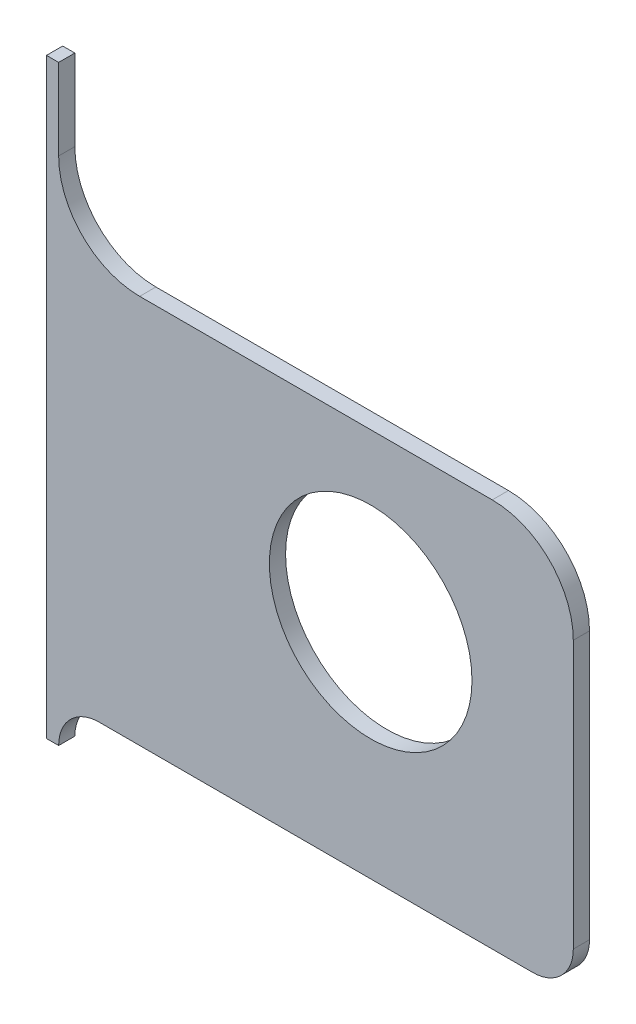
ISO-10303-21;
HEADER;
FILE_DESCRIPTION(('STEP AP214'),'2;1');
FILE_NAME('part.step','',(''),(''),'','','');
FILE_SCHEMA(('AUTOMOTIVE_DESIGN { 1 0 10303 214 1 1 1 1 }'));
ENDSEC;
DATA;
#1=APPLICATION_CONTEXT('core data for automotive mechanical design processes');
#2=APPLICATION_PROTOCOL_DEFINITION('international standard','automotive_design',2000,#1);
#3=PRODUCT_CONTEXT('',#1,'mechanical');
#4=PRODUCT('Part','Part','',(#3));
#5=PRODUCT_RELATED_PRODUCT_CATEGORY('part','',(#4));
#6=PRODUCT_DEFINITION_FORMATION('','',#4);
#7=PRODUCT_DEFINITION_CONTEXT('part definition',#1,'design');
#8=PRODUCT_DEFINITION('design','',#6,#7);
#9=PRODUCT_DEFINITION_SHAPE('','',#8);
#10=(LENGTH_UNIT() NAMED_UNIT(*) SI_UNIT(.MILLI.,.METRE.));
#11=(NAMED_UNIT(*) PLANE_ANGLE_UNIT() SI_UNIT($,.RADIAN.));
#12=(NAMED_UNIT(*) SI_UNIT($,.STERADIAN.) SOLID_ANGLE_UNIT());
#13=UNCERTAINTY_MEASURE_WITH_UNIT(LENGTH_MEASURE(1.E-05),#10,'distance_accuracy_value','');
#14=(GEOMETRIC_REPRESENTATION_CONTEXT(3) GLOBAL_UNCERTAINTY_ASSIGNED_CONTEXT((#13)) GLOBAL_UNIT_ASSIGNED_CONTEXT((#10,
#11,#12)) REPRESENTATION_CONTEXT('',''));
#15=CARTESIAN_POINT('',(0.,0.,0.));
#16=DIRECTION('',(0.,0.,1.));
#17=DIRECTION('',(1.,0.,0.));
#18=AXIS2_PLACEMENT_3D('',#15,#16,#17);
#19=CARTESIAN_POINT('',(0.,0.,42.));
#20=DIRECTION('',(0.,0.,-1.));
#21=DIRECTION('',(-1.,0.,0.));
#22=AXIS2_PLACEMENT_3D('',#19,#20,#21);
#23=PLANE('',#22);
#24=CARTESIAN_POINT('',(0.,19.46,42.));
#25=DIRECTION('',(0.,0.,1.));
#26=DIRECTION('',(1.,0.,0.));
#27=AXIS2_PLACEMENT_3D('',#24,#25,#26);
#28=CIRCLE('',#27,12.5);
#29=CARTESIAN_POINT('',(12.5,19.46,42.));
#30=VERTEX_POINT('',#29);
#31=EDGE_CURVE('E146',#30,#30,#28,.T.);
#32=ORIENTED_EDGE('',*,*,#31,.F.);
#33=EDGE_LOOP('',(#32));
#34=FACE_BOUND('',#33,.T.);
#35=DIRECTION('',(-1.,0.,0.));
#36=VECTOR('',#35,1.);
#37=CARTESIAN_POINT('',(-38.5,-8.00000000000001,42.));
#38=LINE('',#37,#36);
#39=CARTESIAN_POINT('',(20.,-8.,42.));
#40=VERTEX_POINT('',#39);
#41=CARTESIAN_POINT('',(-33.5,-8.00000000000001,42.));
#42=VERTEX_POINT('',#41);
#43=EDGE_CURVE('E141',#40,#42,#38,.T.);
#44=ORIENTED_EDGE('',*,*,#43,.F.);
#45=CARTESIAN_POINT('',(20.,-3.,42.));
#46=DIRECTION('',(0.,0.,-1.));
#47=DIRECTION('',(-1.,0.,0.));
#48=AXIS2_PLACEMENT_3D('',#45,#46,#47);
#49=CIRCLE('',#48,5.);
#50=CARTESIAN_POINT('',(25.,-3.,42.));
#51=VERTEX_POINT('',#50);
#52=EDGE_CURVE('E58',#40,#51,#49,.F.);
#53=ORIENTED_EDGE('',*,*,#52,.T.);
#54=DIRECTION('',(0.,-1.,0.));
#55=VECTOR('',#54,1.);
#56=CARTESIAN_POINT('',(25.,40.,42.));
#57=LINE('',#56,#55);
#58=CARTESIAN_POINT('',(25.,30.,42.));
#59=VERTEX_POINT('',#58);
#60=EDGE_CURVE('E197',#59,#51,#57,.T.);
#61=ORIENTED_EDGE('',*,*,#60,.F.);
#62=CARTESIAN_POINT('',(15.,30.,42.));
#63=DIRECTION('',(0.,0.,-1.));
#64=DIRECTION('',(-1.,0.,0.));
#65=AXIS2_PLACEMENT_3D('',#62,#63,#64);
#66=CIRCLE('',#65,10.);
#67=CARTESIAN_POINT('',(15.,40.,42.));
#68=VERTEX_POINT('',#67);
#69=EDGE_CURVE('E201',#59,#68,#66,.F.);
#70=ORIENTED_EDGE('',*,*,#69,.T.);
#71=DIRECTION('',(1.,0.,0.));
#72=VECTOR('',#71,1.);
#73=CARTESIAN_POINT('',(-28.4999999999999,40.,42.));
#74=LINE('',#73,#72);
#75=CARTESIAN_POINT('',(-28.4999999999999,40.,42.));
#76=VERTEX_POINT('',#75);
#77=EDGE_CURVE('E200',#76,#68,#74,.T.);
#78=ORIENTED_EDGE('',*,*,#77,.F.);
#79=CARTESIAN_POINT('',(-28.5,50.,42.));
#80=DIRECTION('',(0.,0.,-1.));
#81=DIRECTION('',(-1.,0.,0.));
#82=AXIS2_PLACEMENT_3D('',#79,#80,#81);
#83=CIRCLE('',#82,10.);
#84=CARTESIAN_POINT('',(-38.5,50.0000000000001,42.));
#85=VERTEX_POINT('',#84);
#86=EDGE_CURVE('E206',#85,#76,#83,.F.);
#87=ORIENTED_EDGE('',*,*,#86,.F.);
#88=DIRECTION('',(0.,-1.,0.));
#89=VECTOR('',#88,1.);
#90=CARTESIAN_POINT('',(-38.5,60.,42.));
#91=LINE('',#90,#89);
#92=CARTESIAN_POINT('',(-38.5,60.,42.));
#93=VERTEX_POINT('',#92);
#94=EDGE_CURVE('E208',#93,#85,#91,.T.);
#95=ORIENTED_EDGE('',*,*,#94,.F.);
#96=DIRECTION('',(1.,0.,0.));
#97=VECTOR('',#96,1.);
#98=CARTESIAN_POINT('',(-40.,60.,42.));
#99=LINE('',#98,#97);
#100=CARTESIAN_POINT('',(-40.,60.,42.));
#101=VERTEX_POINT('',#100);
#102=EDGE_CURVE('E204',#101,#93,#99,.T.);
#103=ORIENTED_EDGE('',*,*,#102,.F.);
#104=DIRECTION('',(0.,1.,0.));
#105=VECTOR('',#104,1.);
#106=CARTESIAN_POINT('',(-40.,0.,42.));
#107=LINE('',#106,#105);
#108=CARTESIAN_POINT('',(-40.,-13.,42.));
#109=VERTEX_POINT('',#108);
#110=EDGE_CURVE('E136',#109,#101,#107,.T.);
#111=ORIENTED_EDGE('',*,*,#110,.F.);
#112=DIRECTION('',(-1.,0.,0.));
#113=VECTOR('',#112,1.);
#114=CARTESIAN_POINT('',(-40.,-13.,42.));
#115=LINE('',#114,#113);
#116=CARTESIAN_POINT('',(-38.5,-13.,42.));
#117=VERTEX_POINT('',#116);
#118=EDGE_CURVE('E128',#117,#109,#115,.T.);
#119=ORIENTED_EDGE('',*,*,#118,.F.);
#120=CARTESIAN_POINT('',(-33.5,-13.,42.));
#121=DIRECTION('',(0.,0.,-1.));
#122=DIRECTION('',(-1.,0.,0.));
#123=AXIS2_PLACEMENT_3D('',#120,#121,#122);
#124=CIRCLE('',#123,5.);
#125=EDGE_CURVE('E43',#117,#42,#124,.T.);
#126=ORIENTED_EDGE('',*,*,#125,.T.);
#127=EDGE_LOOP('',(#44,#53,#61,#70,#78,#87,#95,#103,#111,#119,#126));
#128=FACE_BOUND('',#127,.T.);
#129=ADVANCED_FACE('F35',(#34,#128),#23,.F.);
#130=CARTESIAN_POINT('',(-28.5,50.,40.));
#131=DIRECTION('',(0.,0.,-1.));
#132=DIRECTION('',(-1.,0.,0.));
#133=AXIS2_PLACEMENT_3D('',#130,#131,#132);
#134=PLANE('',#133);
#135=DIRECTION('',(0.,1.,0.));
#136=VECTOR('',#135,1.);
#137=CARTESIAN_POINT('',(25.,40.,40.));
#138=LINE('',#137,#136);
#139=CARTESIAN_POINT('',(25.,-3.,40.));
#140=VERTEX_POINT('',#139);
#141=CARTESIAN_POINT('',(25.,30.,40.));
#142=VERTEX_POINT('',#141);
#143=EDGE_CURVE('E150',#140,#142,#138,.T.);
#144=ORIENTED_EDGE('',*,*,#143,.F.);
#145=CARTESIAN_POINT('',(20.,-3.,40.));
#146=DIRECTION('',(0.,0.,-1.));
#147=DIRECTION('',(-1.,0.,0.));
#148=AXIS2_PLACEMENT_3D('',#145,#146,#147);
#149=CIRCLE('',#148,5.);
#150=CARTESIAN_POINT('',(20.,-8.,40.));
#151=VERTEX_POINT('',#150);
#152=EDGE_CURVE('E124',#140,#151,#149,.T.);
#153=ORIENTED_EDGE('',*,*,#152,.T.);
#154=DIRECTION('',(1.,0.,0.));
#155=VECTOR('',#154,1.);
#156=CARTESIAN_POINT('',(-28.5,-8.00000000000001,40.));
#157=LINE('',#156,#155);
#158=CARTESIAN_POINT('',(-33.5,-8.00000000000001,40.));
#159=VERTEX_POINT('',#158);
#160=EDGE_CURVE('E143',#159,#151,#157,.T.);
#161=ORIENTED_EDGE('',*,*,#160,.F.);
#162=CARTESIAN_POINT('',(-33.5,-13.,40.));
#163=DIRECTION('',(0.,0.,-1.));
#164=DIRECTION('',(-1.,0.,0.));
#165=AXIS2_PLACEMENT_3D('',#162,#163,#164);
#166=CIRCLE('',#165,5.);
#167=CARTESIAN_POINT('',(-38.5,-13.,40.));
#168=VERTEX_POINT('',#167);
#169=EDGE_CURVE('E11',#159,#168,#166,.F.);
#170=ORIENTED_EDGE('',*,*,#169,.T.);
#171=DIRECTION('',(1.,0.,0.));
#172=VECTOR('',#171,1.);
#173=CARTESIAN_POINT('',(-28.5,-13.,40.));
#174=LINE('',#173,#172);
#175=CARTESIAN_POINT('',(-40.,-13.,40.));
#176=VERTEX_POINT('',#175);
#177=EDGE_CURVE('E131',#176,#168,#174,.T.);
#178=ORIENTED_EDGE('',*,*,#177,.F.);
#179=DIRECTION('',(0.,-1.,0.));
#180=VECTOR('',#179,1.);
#181=CARTESIAN_POINT('',(-40.,40.,40.));
#182=LINE('',#181,#180);
#183=CARTESIAN_POINT('',(-40.,60.,40.));
#184=VERTEX_POINT('',#183);
#185=EDGE_CURVE('E152',#184,#176,#182,.T.);
#186=ORIENTED_EDGE('',*,*,#185,.F.);
#187=DIRECTION('',(-1.,0.,0.));
#188=VECTOR('',#187,1.);
#189=CARTESIAN_POINT('',(-40.,60.,40.));
#190=LINE('',#189,#188);
#191=CARTESIAN_POINT('',(-38.5,60.,40.));
#192=VERTEX_POINT('',#191);
#193=EDGE_CURVE('E164',#192,#184,#190,.T.);
#194=ORIENTED_EDGE('',*,*,#193,.F.);
#195=DIRECTION('',(0.,1.,0.));
#196=VECTOR('',#195,1.);
#197=CARTESIAN_POINT('',(-38.5,60.,40.));
#198=LINE('',#197,#196);
#199=CARTESIAN_POINT('',(-38.5,50.0000000000001,40.));
#200=VERTEX_POINT('',#199);
#201=EDGE_CURVE('E169',#200,#192,#198,.T.);
#202=ORIENTED_EDGE('',*,*,#201,.F.);
#203=CARTESIAN_POINT('',(-28.5,50.,40.));
#204=DIRECTION('',(0.,0.,-1.));
#205=DIRECTION('',(-1.,0.,0.));
#206=AXIS2_PLACEMENT_3D('',#203,#204,#205);
#207=CIRCLE('',#206,10.);
#208=CARTESIAN_POINT('',(-28.4999999999999,40.,40.));
#209=VERTEX_POINT('',#208);
#210=EDGE_CURVE('E161',#209,#200,#207,.T.);
#211=ORIENTED_EDGE('',*,*,#210,.F.);
#212=DIRECTION('',(-1.,0.,0.));
#213=VECTOR('',#212,1.);
#214=CARTESIAN_POINT('',(-28.4999999999999,40.,40.));
#215=LINE('',#214,#213);
#216=CARTESIAN_POINT('',(15.,40.,40.));
#217=VERTEX_POINT('',#216);
#218=EDGE_CURVE('E155',#217,#209,#215,.T.);
#219=ORIENTED_EDGE('',*,*,#218,.F.);
#220=CARTESIAN_POINT('',(15.,30.,40.));
#221=DIRECTION('',(0.,0.,-1.));
#222=DIRECTION('',(-1.,0.,0.));
#223=AXIS2_PLACEMENT_3D('',#220,#221,#222);
#224=CIRCLE('',#223,10.);
#225=EDGE_CURVE('E188',#217,#142,#224,.T.);
#226=ORIENTED_EDGE('',*,*,#225,.T.);
#227=EDGE_LOOP('',(#144,#153,#161,#170,#178,#186,#194,#202,#211,#219,#226));
#228=FACE_BOUND('',#227,.T.);
#229=CARTESIAN_POINT('',(0.,19.46,40.));
#230=DIRECTION('',(0.,0.,-1.));
#231=DIRECTION('',(-1.,0.,0.));
#232=AXIS2_PLACEMENT_3D('',#229,#230,#231);
#233=CIRCLE('',#232,12.5);
#234=CARTESIAN_POINT('',(-12.5,19.46,40.));
#235=VERTEX_POINT('',#234);
#236=EDGE_CURVE('E149',#235,#235,#233,.T.);
#237=ORIENTED_EDGE('',*,*,#236,.F.);
#238=EDGE_LOOP('',(#237));
#239=FACE_BOUND('',#238,.T.);
#240=ADVANCED_FACE('F223',(#228,#239),#134,.T.);
#241=CARTESIAN_POINT('',(-40.,60.,130.));
#242=DIRECTION('',(0.,-1.,0.));
#243=DIRECTION('',(0.,0.,-1.));
#244=AXIS2_PLACEMENT_3D('',#241,#242,#243);
#245=PLANE('',#244);
#246=DIRECTION('',(0.,0.,-1.));
#247=VECTOR('',#246,1.);
#248=CARTESIAN_POINT('',(-40.,60.,130.));
#249=LINE('',#248,#247);
#250=EDGE_CURVE('E168',#101,#184,#249,.T.);
#251=ORIENTED_EDGE('',*,*,#250,.F.);
#252=ORIENTED_EDGE('',*,*,#102,.T.);
#253=DIRECTION('',(0.,0.,-1.));
#254=VECTOR('',#253,1.);
#255=CARTESIAN_POINT('',(-38.5,60.,130.));
#256=LINE('',#255,#254);
#257=EDGE_CURVE('E175',#93,#192,#256,.T.);
#258=ORIENTED_EDGE('',*,*,#257,.T.);
#259=ORIENTED_EDGE('',*,*,#193,.T.);
#260=EDGE_LOOP('',(#251,#252,#258,#259));
#261=FACE_BOUND('',#260,.T.);
#262=ADVANCED_FACE('F244',(#261),#245,.F.);
#263=CARTESIAN_POINT('',(-38.5,60.,130.));
#264=DIRECTION('',(-1.,0.,0.));
#265=DIRECTION('',(0.,0.,1.));
#266=AXIS2_PLACEMENT_3D('',#263,#264,#265);
#267=PLANE('',#266);
#268=ORIENTED_EDGE('',*,*,#257,.F.);
#269=ORIENTED_EDGE('',*,*,#94,.T.);
#270=DIRECTION('',(0.,0.,-1.));
#271=VECTOR('',#270,1.);
#272=CARTESIAN_POINT('',(-38.5,50.0000000000001,130.));
#273=LINE('',#272,#271);
#274=EDGE_CURVE('E176',#85,#200,#273,.T.);
#275=ORIENTED_EDGE('',*,*,#274,.T.);
#276=ORIENTED_EDGE('',*,*,#201,.T.);
#277=EDGE_LOOP('',(#268,#269,#275,#276));
#278=FACE_BOUND('',#277,.T.);
#279=ADVANCED_FACE('F265',(#278),#267,.F.);
#280=CARTESIAN_POINT('',(-40.,0.,40.));
#281=DIRECTION('',(1.,0.,0.));
#282=DIRECTION('',(0.,0.,-1.));
#283=AXIS2_PLACEMENT_3D('',#280,#281,#282);
#284=PLANE('',#283);
#285=ORIENTED_EDGE('',*,*,#185,.T.);
#286=DIRECTION('',(0.,0.,1.));
#287=VECTOR('',#286,1.);
#288=CARTESIAN_POINT('',(-40.,-13.,-73.5));
#289=LINE('',#288,#287);
#290=EDGE_CURVE('E132',#176,#109,#289,.T.);
#291=ORIENTED_EDGE('',*,*,#290,.T.);
#292=ORIENTED_EDGE('',*,*,#110,.T.);
#293=ORIENTED_EDGE('',*,*,#250,.T.);
#294=EDGE_LOOP('',(#285,#291,#292,#293));
#295=FACE_BOUND('',#294,.T.);
#296=ADVANCED_FACE('F262',(#295),#284,.F.);
#297=CARTESIAN_POINT('',(-28.5,50.,130.));
#298=DIRECTION('',(0.,0.,-1.));
#299=DIRECTION('',(-1.,0.,0.));
#300=AXIS2_PLACEMENT_3D('',#297,#298,#299);
#301=CYLINDRICAL_SURFACE('',#300,10.);
#302=ORIENTED_EDGE('',*,*,#274,.F.);
#303=ORIENTED_EDGE('',*,*,#86,.T.);
#304=DIRECTION('',(0.,0.,-1.));
#305=VECTOR('',#304,1.);
#306=CARTESIAN_POINT('',(-28.4999999999999,40.,130.));
#307=LINE('',#306,#305);
#308=EDGE_CURVE('E162',#76,#209,#307,.T.);
#309=ORIENTED_EDGE('',*,*,#308,.T.);
#310=ORIENTED_EDGE('',*,*,#210,.T.);
#311=EDGE_LOOP('',(#302,#303,#309,#310));
#312=FACE_BOUND('',#311,.T.);
#313=ADVANCED_FACE('F264',(#312),#301,.F.);
#314=CARTESIAN_POINT('',(-28.4999999999999,40.,130.));
#315=DIRECTION('',(0.,-1.,0.));
#316=DIRECTION('',(1.,0.,0.));
#317=AXIS2_PLACEMENT_3D('',#314,#315,#316);
#318=PLANE('',#317);
#319=ORIENTED_EDGE('',*,*,#308,.F.);
#320=ORIENTED_EDGE('',*,*,#77,.T.);
#321=DIRECTION('',(0.,0.,-1.));
#322=VECTOR('',#321,1.);
#323=CARTESIAN_POINT('',(15.,40.,130.));
#324=LINE('',#323,#322);
#325=EDGE_CURVE('E184',#68,#217,#324,.T.);
#326=ORIENTED_EDGE('',*,*,#325,.T.);
#327=ORIENTED_EDGE('',*,*,#218,.T.);
#328=EDGE_LOOP('',(#319,#320,#326,#327));
#329=FACE_BOUND('',#328,.T.);
#330=ADVANCED_FACE('F247',(#329),#318,.F.);
#331=CARTESIAN_POINT('',(25.,40.,184.));
#332=DIRECTION('',(-1.,0.,0.));
#333=DIRECTION('',(0.,-1.,0.));
#334=AXIS2_PLACEMENT_3D('',#331,#332,#333);
#335=PLANE('',#334);
#336=ORIENTED_EDGE('',*,*,#60,.T.);
#337=DIRECTION('',(0.,0.,1.));
#338=VECTOR('',#337,1.);
#339=CARTESIAN_POINT('',(25.,-3.,184.));
#340=LINE('',#339,#338);
#341=EDGE_CURVE('E50',#51,#140,#340,.F.);
#342=ORIENTED_EDGE('',*,*,#341,.T.);
#343=ORIENTED_EDGE('',*,*,#143,.T.);
#344=DIRECTION('',(0.,0.,-1.));
#345=VECTOR('',#344,1.);
#346=CARTESIAN_POINT('',(25.,30.,184.));
#347=LINE('',#346,#345);
#348=EDGE_CURVE('E192',#142,#59,#347,.F.);
#349=ORIENTED_EDGE('',*,*,#348,.T.);
#350=EDGE_LOOP('',(#336,#342,#343,#349));
#351=FACE_BOUND('',#350,.T.);
#352=ADVANCED_FACE('F251',(#351),#335,.F.);
#353=CARTESIAN_POINT('',(15.,30.,130.));
#354=DIRECTION('',(0.,0.,-1.));
#355=DIRECTION('',(-1.,0.,0.));
#356=AXIS2_PLACEMENT_3D('',#353,#354,#355);
#357=CYLINDRICAL_SURFACE('',#356,10.);
#358=ORIENTED_EDGE('',*,*,#69,.F.);
#359=ORIENTED_EDGE('',*,*,#348,.F.);
#360=ORIENTED_EDGE('',*,*,#225,.F.);
#361=ORIENTED_EDGE('',*,*,#325,.F.);
#362=EDGE_LOOP('',(#358,#359,#360,#361));
#363=FACE_BOUND('',#362,.T.);
#364=ADVANCED_FACE('F239',(#363),#357,.T.);
#365=CARTESIAN_POINT('',(0.,19.46,32.));
#366=DIRECTION('',(0.,0.,1.));
#367=DIRECTION('',(1.,0.,0.));
#368=AXIS2_PLACEMENT_3D('',#365,#366,#367);
#369=CYLINDRICAL_SURFACE('',#368,12.5);
#370=ORIENTED_EDGE('',*,*,#236,.T.);
#371=EDGE_LOOP('',(#370));
#372=FACE_BOUND('',#371,.T.);
#373=ORIENTED_EDGE('',*,*,#31,.T.);
#374=EDGE_LOOP('',(#373));
#375=FACE_BOUND('',#374,.T.);
#376=ADVANCED_FACE('F246',(#372,#375),#369,.F.);
#377=CARTESIAN_POINT('',(-38.5,-8.00000000000001,-73.5));
#378=DIRECTION('',(0.,1.,0.));
#379=DIRECTION('',(-1.,0.,0.));
#380=AXIS2_PLACEMENT_3D('',#377,#378,#379);
#381=PLANE('',#380);
#382=ORIENTED_EDGE('',*,*,#160,.T.);
#383=DIRECTION('',(0.,0.,1.));
#384=VECTOR('',#383,1.);
#385=CARTESIAN_POINT('',(20.,-8.,-73.5));
#386=LINE('',#385,#384);
#387=EDGE_CURVE('E215',#151,#40,#386,.T.);
#388=ORIENTED_EDGE('',*,*,#387,.T.);
#389=ORIENTED_EDGE('',*,*,#43,.T.);
#390=DIRECTION('',(0.,0.,1.));
#391=VECTOR('',#390,1.);
#392=CARTESIAN_POINT('',(-33.5,-8.00000000000001,40.));
#393=LINE('',#392,#391);
#394=EDGE_CURVE('E121',#42,#159,#393,.F.);
#395=ORIENTED_EDGE('',*,*,#394,.T.);
#396=EDGE_LOOP('',(#382,#388,#389,#395));
#397=FACE_BOUND('',#396,.T.);
#398=ADVANCED_FACE('F228',(#397),#381,.F.);
#399=CARTESIAN_POINT('',(-40.,-13.,-73.5));
#400=DIRECTION('',(0.,1.,0.));
#401=DIRECTION('',(0.,0.,1.));
#402=AXIS2_PLACEMENT_3D('',#399,#400,#401);
#403=PLANE('',#402);
#404=ORIENTED_EDGE('',*,*,#177,.T.);
#405=DIRECTION('',(0.,0.,1.));
#406=VECTOR('',#405,1.);
#407=CARTESIAN_POINT('',(-38.5,-13.,-73.5));
#408=LINE('',#407,#406);
#409=EDGE_CURVE('E120',#168,#117,#408,.T.);
#410=ORIENTED_EDGE('',*,*,#409,.T.);
#411=ORIENTED_EDGE('',*,*,#118,.T.);
#412=ORIENTED_EDGE('',*,*,#290,.F.);
#413=EDGE_LOOP('',(#404,#410,#411,#412));
#414=FACE_BOUND('',#413,.T.);
#415=ADVANCED_FACE('F127',(#414),#403,.F.);
#416=CARTESIAN_POINT('',(20.,-3.,-73.5));
#417=DIRECTION('',(0.,0.,1.));
#418=DIRECTION('',(1.,0.,0.));
#419=AXIS2_PLACEMENT_3D('',#416,#417,#418);
#420=CYLINDRICAL_SURFACE('',#419,5.);
#421=ORIENTED_EDGE('',*,*,#152,.F.);
#422=ORIENTED_EDGE('',*,*,#341,.F.);
#423=ORIENTED_EDGE('',*,*,#52,.F.);
#424=ORIENTED_EDGE('',*,*,#387,.F.);
#425=EDGE_LOOP('',(#421,#422,#423,#424));
#426=FACE_BOUND('',#425,.T.);
#427=ADVANCED_FACE('F229',(#426),#420,.T.);
#428=CARTESIAN_POINT('',(-33.5,-13.,130.));
#429=DIRECTION('',(0.,0.,-1.));
#430=DIRECTION('',(-1.,0.,0.));
#431=AXIS2_PLACEMENT_3D('',#428,#429,#430);
#432=CYLINDRICAL_SURFACE('',#431,5.);
#433=ORIENTED_EDGE('',*,*,#169,.F.);
#434=ORIENTED_EDGE('',*,*,#394,.F.);
#435=ORIENTED_EDGE('',*,*,#125,.F.);
#436=ORIENTED_EDGE('',*,*,#409,.F.);
#437=EDGE_LOOP('',(#433,#434,#435,#436));
#438=FACE_BOUND('',#437,.T.);
#439=ADVANCED_FACE('F37',(#438),#432,.F.);
#440=CLOSED_SHELL('',(#129,#240,#262,#279,#296,#313,#330,#352,#364,#376,#398,#415,#427,#439));
#441=MANIFOLD_SOLID_BREP('B2',#440);
#442=ADVANCED_BREP_SHAPE_REPRESENTATION('',(#18,#441),#14);
#443=SHAPE_DEFINITION_REPRESENTATION(#9,#442);
ENDSEC;
END-ISO-10303-21;
